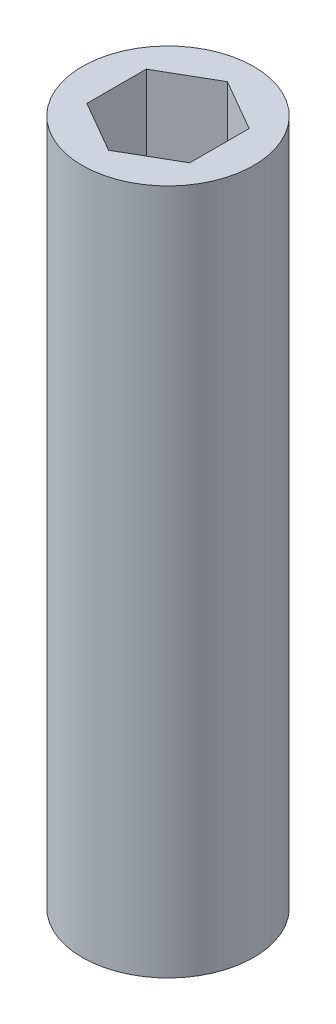
ISO-10303-21;
HEADER;
FILE_DESCRIPTION(('STEP AP214'),'2;1');
FILE_NAME('part.step','',(''),(''),'','','');
FILE_SCHEMA(('AUTOMOTIVE_DESIGN { 1 0 10303 214 1 1 1 1 }'));
ENDSEC;
DATA;
#1=APPLICATION_CONTEXT('core data for automotive mechanical design processes');
#2=APPLICATION_PROTOCOL_DEFINITION('international standard','automotive_design',2000,#1);
#3=PRODUCT_CONTEXT('',#1,'mechanical');
#4=PRODUCT('Part','Part','',(#3));
#5=PRODUCT_RELATED_PRODUCT_CATEGORY('part','',(#4));
#6=PRODUCT_DEFINITION_FORMATION('','',#4);
#7=PRODUCT_DEFINITION_CONTEXT('part definition',#1,'design');
#8=PRODUCT_DEFINITION('design','',#6,#7);
#9=PRODUCT_DEFINITION_SHAPE('','',#8);
#10=(LENGTH_UNIT() NAMED_UNIT(*) SI_UNIT(.MILLI.,.METRE.));
#11=(NAMED_UNIT(*) PLANE_ANGLE_UNIT() SI_UNIT($,.RADIAN.));
#12=(NAMED_UNIT(*) SI_UNIT($,.STERADIAN.) SOLID_ANGLE_UNIT());
#13=UNCERTAINTY_MEASURE_WITH_UNIT(LENGTH_MEASURE(1.E-05),#10,'distance_accuracy_value','');
#14=(GEOMETRIC_REPRESENTATION_CONTEXT(3) GLOBAL_UNCERTAINTY_ASSIGNED_CONTEXT((#13)) GLOBAL_UNIT_ASSIGNED_CONTEXT((#10,
#11,#12)) REPRESENTATION_CONTEXT('',''));
#15=CARTESIAN_POINT('',(0.,0.,0.));
#16=DIRECTION('',(0.,0.,1.));
#17=DIRECTION('',(1.,0.,0.));
#18=AXIS2_PLACEMENT_3D('',#15,#16,#17);
#19=CARTESIAN_POINT('',(0.,80.,0.));
#20=DIRECTION('',(0.,-1.,0.));
#21=DIRECTION('',(0.,0.,-1.));
#22=AXIS2_PLACEMENT_3D('',#19,#20,#21);
#23=CYLINDRICAL_SURFACE('',#22,4.);
#24=CARTESIAN_POINT('',(0.,0.,0.));
#25=DIRECTION('',(0.,1.,0.));
#26=DIRECTION('',(0.,0.,1.));
#27=AXIS2_PLACEMENT_3D('',#24,#25,#26);
#28=CIRCLE('',#27,4.);
#29=CARTESIAN_POINT('',(0.,0.,4.));
#30=VERTEX_POINT('',#29);
#31=EDGE_CURVE('E155',#30,#30,#28,.T.);
#32=ORIENTED_EDGE('',*,*,#31,.F.);
#33=EDGE_LOOP('',(#32));
#34=FACE_BOUND('',#33,.T.);
#35=CARTESIAN_POINT('',(0.,62.,0.));
#36=DIRECTION('',(0.,1.,0.));
#37=DIRECTION('',(0.,0.,1.));
#38=AXIS2_PLACEMENT_3D('',#35,#36,#37);
#39=CIRCLE('',#38,4.);
#40=CARTESIAN_POINT('',(0.,62.,4.));
#41=VERTEX_POINT('',#40);
#42=EDGE_CURVE('E50',#41,#41,#39,.T.);
#43=ORIENTED_EDGE('',*,*,#42,.T.);
#44=EDGE_LOOP('',(#43));
#45=FACE_BOUND('',#44,.T.);
#46=ADVANCED_FACE('F46',(#34,#45),#23,.F.);
#47=CARTESIAN_POINT('',(0.,80.,0.));
#48=DIRECTION('',(0.,1.,0.));
#49=DIRECTION('',(0.,0.,1.));
#50=AXIS2_PLACEMENT_3D('',#47,#48,#49);
#51=PLANE('',#50);
#52=DIRECTION('',(0.866025403784438,0.,0.5));
#53=VECTOR('',#52,1.);
#54=CARTESIAN_POINT('',(-6.,80.,3.46410161513775));
#55=LINE('',#54,#53);
#56=CARTESIAN_POINT('',(-6.,80.,3.46410161513775));
#57=VERTEX_POINT('',#56);
#58=CARTESIAN_POINT('',(0.,80.,6.92820323027551));
#59=VERTEX_POINT('',#58);
#60=EDGE_CURVE('E63',#57,#59,#55,.T.);
#61=ORIENTED_EDGE('',*,*,#60,.F.);
#62=DIRECTION('',(0.,0.,1.));
#63=VECTOR('',#62,1.);
#64=CARTESIAN_POINT('',(-6.,80.,-3.46410161513775));
#65=LINE('',#64,#63);
#66=CARTESIAN_POINT('',(-6.,80.,-3.46410161513775));
#67=VERTEX_POINT('',#66);
#68=EDGE_CURVE('E146',#67,#57,#65,.T.);
#69=ORIENTED_EDGE('',*,*,#68,.F.);
#70=DIRECTION('',(-0.866025403784438,0.,0.5));
#71=VECTOR('',#70,1.);
#72=CARTESIAN_POINT('',(0.,80.,-6.92820323027551));
#73=LINE('',#72,#71);
#74=CARTESIAN_POINT('',(0.,80.,-6.92820323027551));
#75=VERTEX_POINT('',#74);
#76=EDGE_CURVE('E144',#75,#67,#73,.T.);
#77=ORIENTED_EDGE('',*,*,#76,.F.);
#78=DIRECTION('',(-0.866025403784439,0.,-0.5));
#79=VECTOR('',#78,1.);
#80=CARTESIAN_POINT('',(6.,80.,-3.46410161513776));
#81=LINE('',#80,#79);
#82=CARTESIAN_POINT('',(6.,80.,-3.46410161513776));
#83=VERTEX_POINT('',#82);
#84=EDGE_CURVE('E111',#83,#75,#81,.T.);
#85=ORIENTED_EDGE('',*,*,#84,.F.);
#86=DIRECTION('',(0.,0.,-1.));
#87=VECTOR('',#86,1.);
#88=CARTESIAN_POINT('',(6.,80.,3.46410161513775));
#89=LINE('',#88,#87);
#90=CARTESIAN_POINT('',(6.,80.,3.46410161513775));
#91=VERTEX_POINT('',#90);
#92=EDGE_CURVE('E140',#91,#83,#89,.T.);
#93=ORIENTED_EDGE('',*,*,#92,.F.);
#94=DIRECTION('',(0.866025403784438,0.,-0.5));
#95=VECTOR('',#94,1.);
#96=CARTESIAN_POINT('',(0.,80.,6.92820323027551));
#97=LINE('',#96,#95);
#98=EDGE_CURVE('E137',#59,#91,#97,.T.);
#99=ORIENTED_EDGE('',*,*,#98,.F.);
#100=EDGE_LOOP('',(#61,#69,#77,#85,#93,#99));
#101=FACE_BOUND('',#100,.T.);
#102=CARTESIAN_POINT('',(0.,80.,0.));
#103=DIRECTION('',(0.,1.,0.));
#104=DIRECTION('',(0.,0.,1.));
#105=AXIS2_PLACEMENT_3D('',#102,#103,#104);
#106=CIRCLE('',#105,10.);
#107=CARTESIAN_POINT('',(0.,80.,10.));
#108=VERTEX_POINT('',#107);
#109=EDGE_CURVE('E11',#108,#108,#106,.T.);
#110=ORIENTED_EDGE('',*,*,#109,.T.);
#111=EDGE_LOOP('',(#110));
#112=FACE_BOUND('',#111,.T.);
#113=ADVANCED_FACE('F164',(#101,#112),#51,.T.);
#114=CARTESIAN_POINT('',(0.,0.,0.));
#115=DIRECTION('',(0.,1.,0.));
#116=DIRECTION('',(0.,0.,1.));
#117=AXIS2_PLACEMENT_3D('',#114,#115,#116);
#118=PLANE('',#117);
#119=CARTESIAN_POINT('',(0.,0.,0.));
#120=DIRECTION('',(0.,1.,0.));
#121=DIRECTION('',(0.,0.,1.));
#122=AXIS2_PLACEMENT_3D('',#119,#120,#121);
#123=CIRCLE('',#122,10.);
#124=CARTESIAN_POINT('',(0.,0.,10.));
#125=VERTEX_POINT('',#124);
#126=EDGE_CURVE('E55',#125,#125,#123,.T.);
#127=ORIENTED_EDGE('',*,*,#126,.F.);
#128=EDGE_LOOP('',(#127));
#129=FACE_BOUND('',#128,.T.);
#130=ORIENTED_EDGE('',*,*,#31,.T.);
#131=EDGE_LOOP('',(#130));
#132=FACE_BOUND('',#131,.T.);
#133=ADVANCED_FACE('F161',(#129,#132),#118,.F.);
#134=CARTESIAN_POINT('',(0.,80.,0.));
#135=DIRECTION('',(0.,-1.,0.));
#136=DIRECTION('',(0.,0.,-1.));
#137=AXIS2_PLACEMENT_3D('',#134,#135,#136);
#138=CYLINDRICAL_SURFACE('',#137,10.);
#139=ORIENTED_EDGE('',*,*,#109,.F.);
#140=EDGE_LOOP('',(#139));
#141=FACE_BOUND('',#140,.T.);
#142=ORIENTED_EDGE('',*,*,#126,.T.);
#143=EDGE_LOOP('',(#142));
#144=FACE_BOUND('',#143,.T.);
#145=ADVANCED_FACE('F48',(#141,#144),#138,.T.);
#146=CARTESIAN_POINT('',(-6.,62.,3.46410161513775));
#147=DIRECTION('',(-0.5,0.,0.866025403784439));
#148=DIRECTION('',(0.866025403784439,0.,0.5));
#149=AXIS2_PLACEMENT_3D('',#146,#147,#148);
#150=PLANE('',#149);
#151=ORIENTED_EDGE('',*,*,#60,.T.);
#152=DIRECTION('',(0.,1.,0.));
#153=VECTOR('',#152,1.);
#154=CARTESIAN_POINT('',(0.,62.,6.92820323027551));
#155=LINE('',#154,#153);
#156=CARTESIAN_POINT('',(0.,62.,6.92820323027551));
#157=VERTEX_POINT('',#156);
#158=EDGE_CURVE('E93',#157,#59,#155,.T.);
#159=ORIENTED_EDGE('',*,*,#158,.F.);
#160=DIRECTION('',(0.866025403784438,0.,0.5));
#161=VECTOR('',#160,1.);
#162=CARTESIAN_POINT('',(-6.,62.,3.46410161513775));
#163=LINE('',#162,#161);
#164=CARTESIAN_POINT('',(-6.,62.,3.46410161513775));
#165=VERTEX_POINT('',#164);
#166=EDGE_CURVE('E148',#165,#157,#163,.T.);
#167=ORIENTED_EDGE('',*,*,#166,.F.);
#168=DIRECTION('',(0.,1.,0.));
#169=VECTOR('',#168,1.);
#170=CARTESIAN_POINT('',(-6.,62.,3.46410161513775));
#171=LINE('',#170,#169);
#172=EDGE_CURVE('E71',#165,#57,#171,.T.);
#173=ORIENTED_EDGE('',*,*,#172,.T.);
#174=EDGE_LOOP('',(#151,#159,#167,#173));
#175=FACE_BOUND('',#174,.T.);
#176=ADVANCED_FACE('F186',(#175),#150,.F.);
#177=CARTESIAN_POINT('',(-6.,62.,-3.46410161513775));
#178=DIRECTION('',(-1.,0.,0.));
#179=DIRECTION('',(0.,0.,1.));
#180=AXIS2_PLACEMENT_3D('',#177,#178,#179);
#181=PLANE('',#180);
#182=ORIENTED_EDGE('',*,*,#68,.T.);
#183=ORIENTED_EDGE('',*,*,#172,.F.);
#184=DIRECTION('',(0.,0.,1.));
#185=VECTOR('',#184,1.);
#186=CARTESIAN_POINT('',(-6.,62.,-3.46410161513775));
#187=LINE('',#186,#185);
#188=CARTESIAN_POINT('',(-6.,62.,-3.46410161513775));
#189=VERTEX_POINT('',#188);
#190=EDGE_CURVE('E123',#189,#165,#187,.T.);
#191=ORIENTED_EDGE('',*,*,#190,.F.);
#192=DIRECTION('',(0.,1.,0.));
#193=VECTOR('',#192,1.);
#194=CARTESIAN_POINT('',(-6.,62.,-3.46410161513775));
#195=LINE('',#194,#193);
#196=EDGE_CURVE('E115',#189,#67,#195,.T.);
#197=ORIENTED_EDGE('',*,*,#196,.T.);
#198=EDGE_LOOP('',(#182,#183,#191,#197));
#199=FACE_BOUND('',#198,.T.);
#200=ADVANCED_FACE('F183',(#199),#181,.F.);
#201=CARTESIAN_POINT('',(0.,62.,-6.92820323027551));
#202=DIRECTION('',(-0.5,0.,-0.866025403784438));
#203=DIRECTION('',(-0.866025403784439,0.,0.5));
#204=AXIS2_PLACEMENT_3D('',#201,#202,#203);
#205=PLANE('',#204);
#206=ORIENTED_EDGE('',*,*,#76,.T.);
#207=ORIENTED_EDGE('',*,*,#196,.F.);
#208=DIRECTION('',(-0.866025403784438,0.,0.5));
#209=VECTOR('',#208,1.);
#210=CARTESIAN_POINT('',(0.,62.,-6.92820323027551));
#211=LINE('',#210,#209);
#212=CARTESIAN_POINT('',(0.,62.,-6.92820323027551));
#213=VERTEX_POINT('',#212);
#214=EDGE_CURVE('E119',#213,#189,#211,.T.);
#215=ORIENTED_EDGE('',*,*,#214,.F.);
#216=DIRECTION('',(0.,1.,0.));
#217=VECTOR('',#216,1.);
#218=CARTESIAN_POINT('',(0.,62.,-6.92820323027551));
#219=LINE('',#218,#217);
#220=EDGE_CURVE('E104',#213,#75,#219,.T.);
#221=ORIENTED_EDGE('',*,*,#220,.T.);
#222=EDGE_LOOP('',(#206,#207,#215,#221));
#223=FACE_BOUND('',#222,.T.);
#224=ADVANCED_FACE('F120',(#223),#205,.F.);
#225=CARTESIAN_POINT('',(6.,62.,-3.46410161513776));
#226=DIRECTION('',(0.5,0.,-0.866025403784439));
#227=DIRECTION('',(-0.866025403784439,0.,-0.5));
#228=AXIS2_PLACEMENT_3D('',#225,#226,#227);
#229=PLANE('',#228);
#230=ORIENTED_EDGE('',*,*,#84,.T.);
#231=ORIENTED_EDGE('',*,*,#220,.F.);
#232=DIRECTION('',(-0.866025403784439,0.,-0.5));
#233=VECTOR('',#232,1.);
#234=CARTESIAN_POINT('',(6.,62.,-3.46410161513776));
#235=LINE('',#234,#233);
#236=CARTESIAN_POINT('',(6.,62.,-3.46410161513776));
#237=VERTEX_POINT('',#236);
#238=EDGE_CURVE('E108',#237,#213,#235,.T.);
#239=ORIENTED_EDGE('',*,*,#238,.F.);
#240=DIRECTION('',(0.,1.,0.));
#241=VECTOR('',#240,1.);
#242=CARTESIAN_POINT('',(6.,62.,-3.46410161513776));
#243=LINE('',#242,#241);
#244=EDGE_CURVE('E116',#237,#83,#243,.T.);
#245=ORIENTED_EDGE('',*,*,#244,.T.);
#246=EDGE_LOOP('',(#230,#231,#239,#245));
#247=FACE_BOUND('',#246,.T.);
#248=ADVANCED_FACE('F106',(#247),#229,.F.);
#249=CARTESIAN_POINT('',(6.,62.,3.46410161513775));
#250=DIRECTION('',(1.,0.,0.));
#251=DIRECTION('',(0.,0.,-1.));
#252=AXIS2_PLACEMENT_3D('',#249,#250,#251);
#253=PLANE('',#252);
#254=ORIENTED_EDGE('',*,*,#92,.T.);
#255=ORIENTED_EDGE('',*,*,#244,.F.);
#256=DIRECTION('',(0.,0.,-1.));
#257=VECTOR('',#256,1.);
#258=CARTESIAN_POINT('',(6.,62.,3.46410161513775));
#259=LINE('',#258,#257);
#260=CARTESIAN_POINT('',(6.,62.,3.46410161513775));
#261=VERTEX_POINT('',#260);
#262=EDGE_CURVE('E129',#261,#237,#259,.T.);
#263=ORIENTED_EDGE('',*,*,#262,.F.);
#264=DIRECTION('',(0.,1.,0.));
#265=VECTOR('',#264,1.);
#266=CARTESIAN_POINT('',(6.,62.,3.46410161513775));
#267=LINE('',#266,#265);
#268=EDGE_CURVE('E152',#261,#91,#267,.T.);
#269=ORIENTED_EDGE('',*,*,#268,.T.);
#270=EDGE_LOOP('',(#254,#255,#263,#269));
#271=FACE_BOUND('',#270,.T.);
#272=ADVANCED_FACE('F179',(#271),#253,.F.);
#273=CARTESIAN_POINT('',(0.,62.,6.92820323027551));
#274=DIRECTION('',(0.5,0.,0.866025403784438));
#275=DIRECTION('',(0.866025403784439,0.,-0.5));
#276=AXIS2_PLACEMENT_3D('',#273,#274,#275);
#277=PLANE('',#276);
#278=ORIENTED_EDGE('',*,*,#98,.T.);
#279=ORIENTED_EDGE('',*,*,#268,.F.);
#280=DIRECTION('',(0.866025403784438,0.,-0.5));
#281=VECTOR('',#280,1.);
#282=CARTESIAN_POINT('',(0.,62.,6.92820323027551));
#283=LINE('',#282,#281);
#284=EDGE_CURVE('E131',#157,#261,#283,.T.);
#285=ORIENTED_EDGE('',*,*,#284,.F.);
#286=ORIENTED_EDGE('',*,*,#158,.T.);
#287=EDGE_LOOP('',(#278,#279,#285,#286));
#288=FACE_BOUND('',#287,.T.);
#289=ADVANCED_FACE('F174',(#288),#277,.F.);
#290=CARTESIAN_POINT('',(0.,62.,0.));
#291=DIRECTION('',(0.,1.,0.));
#292=DIRECTION('',(0.,0.,1.));
#293=AXIS2_PLACEMENT_3D('',#290,#291,#292);
#294=PLANE('',#293);
#295=ORIENTED_EDGE('',*,*,#42,.F.);
#296=EDGE_LOOP('',(#295));
#297=FACE_BOUND('',#296,.T.);
#298=ORIENTED_EDGE('',*,*,#166,.T.);
#299=ORIENTED_EDGE('',*,*,#284,.T.);
#300=ORIENTED_EDGE('',*,*,#262,.T.);
#301=ORIENTED_EDGE('',*,*,#238,.T.);
#302=ORIENTED_EDGE('',*,*,#214,.T.);
#303=ORIENTED_EDGE('',*,*,#190,.T.);
#304=EDGE_LOOP('',(#298,#299,#300,#301,#302,#303));
#305=FACE_BOUND('',#304,.T.);
#306=ADVANCED_FACE('F126',(#297,#305),#294,.T.);
#307=CLOSED_SHELL('',(#46,#113,#133,#145,#176,#200,#224,#248,#272,#289,#306));
#308=MANIFOLD_SOLID_BREP('B2',#307);
#309=ADVANCED_BREP_SHAPE_REPRESENTATION('',(#18,#308),#14);
#310=SHAPE_DEFINITION_REPRESENTATION(#9,#309);
ENDSEC;
END-ISO-10303-21;
